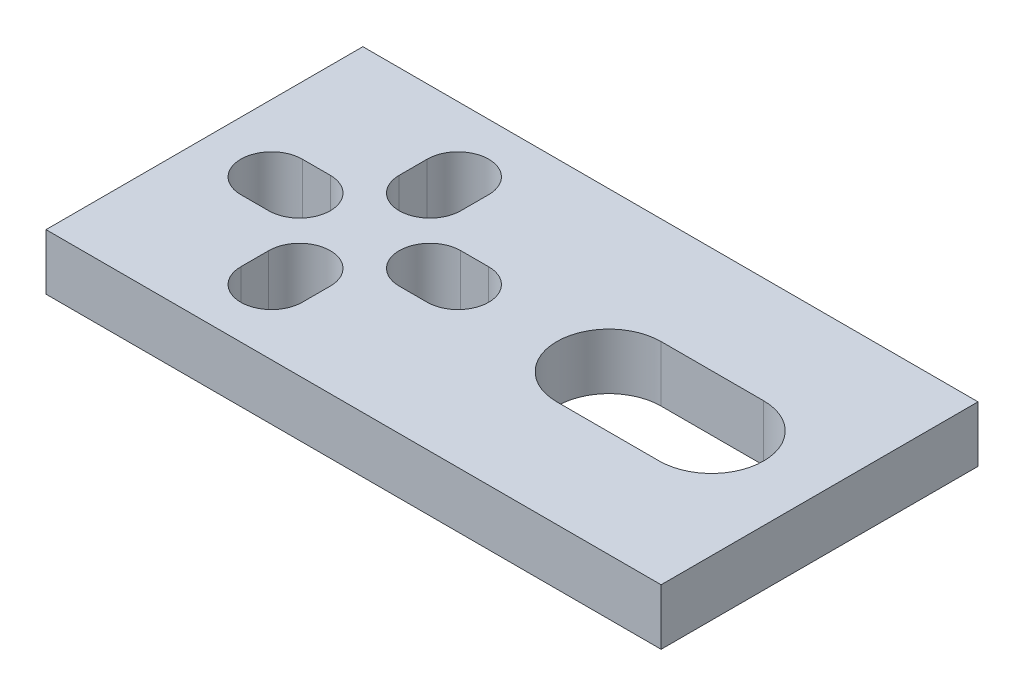
ISO-10303-21;
HEADER;
FILE_DESCRIPTION(('STEP AP214'),'2;1');
FILE_NAME('part.step','',(''),(''),'','','');
FILE_SCHEMA(('AUTOMOTIVE_DESIGN { 1 0 10303 214 1 1 1 1 }'));
ENDSEC;
DATA;
#1=APPLICATION_CONTEXT('core data for automotive mechanical design processes');
#2=APPLICATION_PROTOCOL_DEFINITION('international standard','automotive_design',2000,#1);
#3=PRODUCT_CONTEXT('',#1,'mechanical');
#4=PRODUCT('Part','Part','',(#3));
#5=PRODUCT_RELATED_PRODUCT_CATEGORY('part','',(#4));
#6=PRODUCT_DEFINITION_FORMATION('','',#4);
#7=PRODUCT_DEFINITION_CONTEXT('part definition',#1,'design');
#8=PRODUCT_DEFINITION('design','',#6,#7);
#9=PRODUCT_DEFINITION_SHAPE('','',#8);
#10=(LENGTH_UNIT() NAMED_UNIT(*) SI_UNIT(.MILLI.,.METRE.));
#11=(NAMED_UNIT(*) PLANE_ANGLE_UNIT() SI_UNIT($,.RADIAN.));
#12=(NAMED_UNIT(*) SI_UNIT($,.STERADIAN.) SOLID_ANGLE_UNIT());
#13=UNCERTAINTY_MEASURE_WITH_UNIT(LENGTH_MEASURE(1.E-05),#10,'distance_accuracy_value','');
#14=(GEOMETRIC_REPRESENTATION_CONTEXT(3) GLOBAL_UNCERTAINTY_ASSIGNED_CONTEXT((#13)) GLOBAL_UNIT_ASSIGNED_CONTEXT((#10,
#11,#12)) REPRESENTATION_CONTEXT('',''));
#15=CARTESIAN_POINT('',(0.,0.,0.));
#16=DIRECTION('',(0.,0.,1.));
#17=DIRECTION('',(1.,0.,0.));
#18=AXIS2_PLACEMENT_3D('',#15,#16,#17);
#19=CARTESIAN_POINT('',(0.,3.,0.));
#20=DIRECTION('',(1.,0.,0.));
#21=DIRECTION('',(0.,0.,-1.));
#22=AXIS2_PLACEMENT_3D('',#19,#20,#21);
#23=PLANE('',#22);
#24=DIRECTION('',(0.,0.,1.));
#25=VECTOR('',#24,1.);
#26=CARTESIAN_POINT('',(0.,0.,0.));
#27=LINE('',#26,#25);
#28=CARTESIAN_POINT('',(0.,0.,-17.));
#29=VERTEX_POINT('',#28);
#30=CARTESIAN_POINT('',(0.,0.,0.));
#31=VERTEX_POINT('',#30);
#32=EDGE_CURVE('E352',#29,#31,#27,.T.);
#33=ORIENTED_EDGE('',*,*,#32,.T.);
#34=DIRECTION('',(0.,-1.,0.));
#35=VECTOR('',#34,1.);
#36=CARTESIAN_POINT('',(0.,3.,0.));
#37=LINE('',#36,#35);
#38=CARTESIAN_POINT('',(0.,3.,0.));
#39=VERTEX_POINT('',#38);
#40=EDGE_CURVE('E11',#39,#31,#37,.T.);
#41=ORIENTED_EDGE('',*,*,#40,.F.);
#42=DIRECTION('',(0.,0.,1.));
#43=VECTOR('',#42,1.);
#44=CARTESIAN_POINT('',(0.,3.,0.));
#45=LINE('',#44,#43);
#46=CARTESIAN_POINT('',(0.,3.,-17.));
#47=VERTEX_POINT('',#46);
#48=EDGE_CURVE('E359',#47,#39,#45,.T.);
#49=ORIENTED_EDGE('',*,*,#48,.F.);
#50=DIRECTION('',(0.,-1.,0.));
#51=VECTOR('',#50,1.);
#52=CARTESIAN_POINT('',(0.,3.,-17.));
#53=LINE('',#52,#51);
#54=EDGE_CURVE('E369',#47,#29,#53,.T.);
#55=ORIENTED_EDGE('',*,*,#54,.T.);
#56=EDGE_LOOP('',(#33,#41,#49,#55));
#57=FACE_BOUND('',#56,.T.);
#58=ADVANCED_FACE('F34',(#57),#23,.F.);
#59=CARTESIAN_POINT('',(0.,3.,0.));
#60=DIRECTION('',(0.,0.,-1.));
#61=DIRECTION('',(-1.,0.,0.));
#62=AXIS2_PLACEMENT_3D('',#59,#60,#61);
#63=PLANE('',#62);
#64=DIRECTION('',(1.,0.,0.));
#65=VECTOR('',#64,1.);
#66=CARTESIAN_POINT('',(0.,0.,0.));
#67=LINE('',#66,#65);
#68=CARTESIAN_POINT('',(33.,0.,0.));
#69=VERTEX_POINT('',#68);
#70=EDGE_CURVE('E372',#31,#69,#67,.T.);
#71=ORIENTED_EDGE('',*,*,#70,.T.);
#72=DIRECTION('',(0.,-1.,0.));
#73=VECTOR('',#72,1.);
#74=CARTESIAN_POINT('',(33.,3.,0.));
#75=LINE('',#74,#73);
#76=CARTESIAN_POINT('',(33.,3.,0.));
#77=VERTEX_POINT('',#76);
#78=EDGE_CURVE('E41',#77,#69,#75,.T.);
#79=ORIENTED_EDGE('',*,*,#78,.F.);
#80=DIRECTION('',(1.,0.,0.));
#81=VECTOR('',#80,1.);
#82=CARTESIAN_POINT('',(0.,3.,0.));
#83=LINE('',#82,#81);
#84=EDGE_CURVE('E362',#39,#77,#83,.T.);
#85=ORIENTED_EDGE('',*,*,#84,.F.);
#86=ORIENTED_EDGE('',*,*,#40,.T.);
#87=EDGE_LOOP('',(#71,#79,#85,#86));
#88=FACE_BOUND('',#87,.T.);
#89=ADVANCED_FACE('F401',(#88),#63,.F.);
#90=CARTESIAN_POINT('',(33.,3.,0.));
#91=DIRECTION('',(-1.,0.,0.));
#92=DIRECTION('',(0.,0.,1.));
#93=AXIS2_PLACEMENT_3D('',#90,#91,#92);
#94=PLANE('',#93);
#95=DIRECTION('',(0.,0.,-1.));
#96=VECTOR('',#95,1.);
#97=CARTESIAN_POINT('',(33.,0.,0.));
#98=LINE('',#97,#96);
#99=CARTESIAN_POINT('',(33.,0.,-17.));
#100=VERTEX_POINT('',#99);
#101=EDGE_CURVE('E374',#69,#100,#98,.T.);
#102=ORIENTED_EDGE('',*,*,#101,.T.);
#103=DIRECTION('',(0.,-1.,0.));
#104=VECTOR('',#103,1.);
#105=CARTESIAN_POINT('',(33.,3.,-17.));
#106=LINE('',#105,#104);
#107=CARTESIAN_POINT('',(33.,3.,-17.));
#108=VERTEX_POINT('',#107);
#109=EDGE_CURVE('E379',#108,#100,#106,.T.);
#110=ORIENTED_EDGE('',*,*,#109,.F.);
#111=DIRECTION('',(0.,0.,-1.));
#112=VECTOR('',#111,1.);
#113=CARTESIAN_POINT('',(33.,3.,0.));
#114=LINE('',#113,#112);
#115=EDGE_CURVE('E365',#77,#108,#114,.T.);
#116=ORIENTED_EDGE('',*,*,#115,.F.);
#117=ORIENTED_EDGE('',*,*,#78,.T.);
#118=EDGE_LOOP('',(#102,#110,#116,#117));
#119=FACE_BOUND('',#118,.T.);
#120=ADVANCED_FACE('F386',(#119),#94,.F.);
#121=CARTESIAN_POINT('',(0.,3.,-17.));
#122=DIRECTION('',(0.,0.,1.));
#123=DIRECTION('',(1.,0.,0.));
#124=AXIS2_PLACEMENT_3D('',#121,#122,#123);
#125=PLANE('',#124);
#126=DIRECTION('',(-1.,0.,0.));
#127=VECTOR('',#126,1.);
#128=CARTESIAN_POINT('',(0.,0.,-17.));
#129=LINE('',#128,#127);
#130=EDGE_CURVE('E363',#100,#29,#129,.T.);
#131=ORIENTED_EDGE('',*,*,#130,.T.);
#132=ORIENTED_EDGE('',*,*,#54,.F.);
#133=DIRECTION('',(-1.,0.,0.));
#134=VECTOR('',#133,1.);
#135=CARTESIAN_POINT('',(0.,3.,-17.));
#136=LINE('',#135,#134);
#137=EDGE_CURVE('E367',#108,#47,#136,.T.);
#138=ORIENTED_EDGE('',*,*,#137,.F.);
#139=ORIENTED_EDGE('',*,*,#109,.T.);
#140=EDGE_LOOP('',(#131,#132,#138,#139));
#141=FACE_BOUND('',#140,.T.);
#142=ADVANCED_FACE('F394',(#141),#125,.F.);
#143=CARTESIAN_POINT('',(0.,3.,0.));
#144=DIRECTION('',(0.,-1.,0.));
#145=DIRECTION('',(0.,0.,-1.));
#146=AXIS2_PLACEMENT_3D('',#143,#144,#145);
#147=PLANE('',#146);
#148=DIRECTION('',(0.,0.,1.));
#149=VECTOR('',#148,1.);
#150=CARTESIAN_POINT('',(6.94999999999999,3.,-5.));
#151=LINE('',#150,#149);
#152=CARTESIAN_POINT('',(6.94999999999999,3.,-5.));
#153=VERTEX_POINT('',#152);
#154=CARTESIAN_POINT('',(6.94999999999999,3.,-3.5));
#155=VERTEX_POINT('',#154);
#156=EDGE_CURVE('E221',#153,#155,#151,.T.);
#157=ORIENTED_EDGE('',*,*,#156,.F.);
#158=CARTESIAN_POINT('',(8.6,3.,-5.));
#159=DIRECTION('',(0.,1.,0.));
#160=DIRECTION('',(0.,0.,-1.));
#161=AXIS2_PLACEMENT_3D('',#158,#159,#160);
#162=CIRCLE('',#161,1.65000000000001);
#163=CARTESIAN_POINT('',(10.25,3.,-5.));
#164=VERTEX_POINT('',#163);
#165=EDGE_CURVE('E48',#164,#153,#162,.T.);
#166=ORIENTED_EDGE('',*,*,#165,.F.);
#167=DIRECTION('',(0.,0.,-1.));
#168=VECTOR('',#167,1.);
#169=CARTESIAN_POINT('',(10.25,3.,-5.));
#170=LINE('',#169,#168);
#171=CARTESIAN_POINT('',(10.25,3.,-3.5));
#172=VERTEX_POINT('',#171);
#173=EDGE_CURVE('E212',#172,#164,#170,.T.);
#174=ORIENTED_EDGE('',*,*,#173,.F.);
#175=CARTESIAN_POINT('',(8.6,3.,-3.5));
#176=DIRECTION('',(0.,1.,0.));
#177=DIRECTION('',(0.,0.,-1.));
#178=AXIS2_PLACEMENT_3D('',#175,#176,#177);
#179=CIRCLE('',#178,1.65);
#180=EDGE_CURVE('E215',#155,#172,#179,.T.);
#181=ORIENTED_EDGE('',*,*,#180,.F.);
#182=EDGE_LOOP('',(#157,#166,#174,#181));
#183=FACE_BOUND('',#182,.T.);
#184=DIRECTION('',(-1.,0.,0.));
#185=VECTOR('',#184,1.);
#186=CARTESIAN_POINT('',(13.6,3.,-10.15));
#187=LINE('',#186,#185);
#188=CARTESIAN_POINT('',(13.6,3.,-10.15));
#189=VERTEX_POINT('',#188);
#190=CARTESIAN_POINT('',(12.1,3.,-10.15));
#191=VERTEX_POINT('',#190);
#192=EDGE_CURVE('E246',#189,#191,#187,.T.);
#193=ORIENTED_EDGE('',*,*,#192,.F.);
#194=CARTESIAN_POINT('',(13.6,3.,-8.5));
#195=DIRECTION('',(0.,1.,0.));
#196=DIRECTION('',(0.,0.,-1.));
#197=AXIS2_PLACEMENT_3D('',#194,#195,#196);
#198=CIRCLE('',#197,1.65);
#199=CARTESIAN_POINT('',(13.6,3.,-6.85));
#200=VERTEX_POINT('',#199);
#201=EDGE_CURVE('E227',#200,#189,#198,.T.);
#202=ORIENTED_EDGE('',*,*,#201,.F.);
#203=DIRECTION('',(1.,0.,0.));
#204=VECTOR('',#203,1.);
#205=CARTESIAN_POINT('',(13.6,3.,-6.85));
#206=LINE('',#205,#204);
#207=CARTESIAN_POINT('',(12.1,3.,-6.85));
#208=VERTEX_POINT('',#207);
#209=EDGE_CURVE('E235',#208,#200,#206,.T.);
#210=ORIENTED_EDGE('',*,*,#209,.F.);
#211=CARTESIAN_POINT('',(12.1,3.,-8.5));
#212=DIRECTION('',(0.,1.,0.));
#213=DIRECTION('',(0.,0.,-1.));
#214=AXIS2_PLACEMENT_3D('',#211,#212,#213);
#215=CIRCLE('',#214,1.65);
#216=EDGE_CURVE('E249',#191,#208,#215,.T.);
#217=ORIENTED_EDGE('',*,*,#216,.F.);
#218=EDGE_LOOP('',(#193,#202,#210,#217));
#219=FACE_BOUND('',#218,.T.);
#220=DIRECTION('',(1.,0.,0.));
#221=VECTOR('',#220,1.);
#222=CARTESIAN_POINT('',(3.6,3.,-6.85));
#223=LINE('',#222,#221);
#224=CARTESIAN_POINT('',(3.6,3.,-6.85));
#225=VERTEX_POINT('',#224);
#226=CARTESIAN_POINT('',(5.1,3.,-6.85));
#227=VERTEX_POINT('',#226);
#228=EDGE_CURVE('E278',#225,#227,#223,.T.);
#229=ORIENTED_EDGE('',*,*,#228,.F.);
#230=CARTESIAN_POINT('',(3.6,3.,-8.5));
#231=DIRECTION('',(0.,1.,0.));
#232=DIRECTION('',(0.,0.,1.));
#233=AXIS2_PLACEMENT_3D('',#230,#231,#232);
#234=CIRCLE('',#233,1.65);
#235=CARTESIAN_POINT('',(3.6,3.,-10.15));
#236=VERTEX_POINT('',#235);
#237=EDGE_CURVE('E256',#236,#225,#234,.T.);
#238=ORIENTED_EDGE('',*,*,#237,.F.);
#239=DIRECTION('',(-1.,0.,0.));
#240=VECTOR('',#239,1.);
#241=CARTESIAN_POINT('',(3.6,3.,-10.15));
#242=LINE('',#241,#240);
#243=CARTESIAN_POINT('',(5.1,3.,-10.15));
#244=VERTEX_POINT('',#243);
#245=EDGE_CURVE('E267',#244,#236,#242,.T.);
#246=ORIENTED_EDGE('',*,*,#245,.F.);
#247=CARTESIAN_POINT('',(5.1,3.,-8.5));
#248=DIRECTION('',(0.,1.,0.));
#249=DIRECTION('',(0.,0.,1.));
#250=AXIS2_PLACEMENT_3D('',#247,#248,#249);
#251=CIRCLE('',#250,1.65);
#252=EDGE_CURVE('E281',#227,#244,#251,.T.);
#253=ORIENTED_EDGE('',*,*,#252,.F.);
#254=EDGE_LOOP('',(#229,#238,#246,#253));
#255=FACE_BOUND('',#254,.T.);
#256=DIRECTION('',(0.,0.,-1.));
#257=VECTOR('',#256,1.);
#258=CARTESIAN_POINT('',(10.25,3.,-12.));
#259=LINE('',#258,#257);
#260=CARTESIAN_POINT('',(10.25,3.,-12.));
#261=VERTEX_POINT('',#260);
#262=CARTESIAN_POINT('',(10.25,3.,-13.5));
#263=VERTEX_POINT('',#262);
#264=EDGE_CURVE('E310',#261,#263,#259,.T.);
#265=ORIENTED_EDGE('',*,*,#264,.F.);
#266=CARTESIAN_POINT('',(8.6,3.,-12.));
#267=DIRECTION('',(0.,1.,0.));
#268=DIRECTION('',(0.,0.,1.));
#269=AXIS2_PLACEMENT_3D('',#266,#267,#268);
#270=CIRCLE('',#269,1.65000000000001);
#271=CARTESIAN_POINT('',(6.94999999999999,3.,-12.));
#272=VERTEX_POINT('',#271);
#273=EDGE_CURVE('E288',#272,#261,#270,.T.);
#274=ORIENTED_EDGE('',*,*,#273,.F.);
#275=DIRECTION('',(0.,0.,1.));
#276=VECTOR('',#275,1.);
#277=CARTESIAN_POINT('',(6.94999999999999,3.,-12.));
#278=LINE('',#277,#276);
#279=CARTESIAN_POINT('',(6.94999999999999,3.,-13.5));
#280=VERTEX_POINT('',#279);
#281=EDGE_CURVE('E299',#280,#272,#278,.T.);
#282=ORIENTED_EDGE('',*,*,#281,.F.);
#283=CARTESIAN_POINT('',(8.6,3.,-13.5));
#284=DIRECTION('',(0.,1.,0.));
#285=DIRECTION('',(0.,0.,1.));
#286=AXIS2_PLACEMENT_3D('',#283,#284,#285);
#287=CIRCLE('',#286,1.65);
#288=EDGE_CURVE('E313',#263,#280,#287,.T.);
#289=ORIENTED_EDGE('',*,*,#288,.F.);
#290=EDGE_LOOP('',(#265,#274,#282,#289));
#291=FACE_BOUND('',#290,.T.);
#292=DIRECTION('',(1.,0.,0.));
#293=VECTOR('',#292,1.);
#294=CARTESIAN_POINT('',(21.7,3.,-5.7));
#295=LINE('',#294,#293);
#296=CARTESIAN_POINT('',(21.7,3.,-5.7));
#297=VERTEX_POINT('',#296);
#298=CARTESIAN_POINT('',(27.2,3.,-5.7));
#299=VERTEX_POINT('',#298);
#300=EDGE_CURVE('E342',#297,#299,#295,.T.);
#301=ORIENTED_EDGE('',*,*,#300,.F.);
#302=CARTESIAN_POINT('',(21.7,3.,-8.5));
#303=DIRECTION('',(0.,1.,0.));
#304=DIRECTION('',(0.,0.,1.));
#305=AXIS2_PLACEMENT_3D('',#302,#303,#304);
#306=CIRCLE('',#305,2.8);
#307=CARTESIAN_POINT('',(21.7,3.,-11.3));
#308=VERTEX_POINT('',#307);
#309=EDGE_CURVE('E320',#308,#297,#306,.T.);
#310=ORIENTED_EDGE('',*,*,#309,.F.);
#311=DIRECTION('',(-1.,0.,0.));
#312=VECTOR('',#311,1.);
#313=CARTESIAN_POINT('',(21.7,3.,-11.3));
#314=LINE('',#313,#312);
#315=CARTESIAN_POINT('',(27.2,3.,-11.3));
#316=VERTEX_POINT('',#315);
#317=EDGE_CURVE('E331',#316,#308,#314,.T.);
#318=ORIENTED_EDGE('',*,*,#317,.F.);
#319=CARTESIAN_POINT('',(27.2,3.,-8.5));
#320=DIRECTION('',(0.,1.,0.));
#321=DIRECTION('',(0.,0.,1.));
#322=AXIS2_PLACEMENT_3D('',#319,#320,#321);
#323=CIRCLE('',#322,2.8);
#324=EDGE_CURVE('E345',#299,#316,#323,.T.);
#325=ORIENTED_EDGE('',*,*,#324,.F.);
#326=EDGE_LOOP('',(#301,#310,#318,#325));
#327=FACE_BOUND('',#326,.T.);
#328=ORIENTED_EDGE('',*,*,#48,.T.);
#329=ORIENTED_EDGE('',*,*,#84,.T.);
#330=ORIENTED_EDGE('',*,*,#115,.T.);
#331=ORIENTED_EDGE('',*,*,#137,.T.);
#332=EDGE_LOOP('',(#328,#329,#330,#331));
#333=FACE_BOUND('',#332,.T.);
#334=ADVANCED_FACE('F400',(#183,#219,#255,#291,#327,#333),#147,.F.);
#335=CARTESIAN_POINT('',(0.,0.,0.));
#336=DIRECTION('',(0.,-1.,0.));
#337=DIRECTION('',(0.,0.,-1.));
#338=AXIS2_PLACEMENT_3D('',#335,#336,#337);
#339=PLANE('',#338);
#340=CARTESIAN_POINT('',(8.6,0.,-5.));
#341=DIRECTION('',(0.,1.,0.));
#342=DIRECTION('',(0.,0.,-1.));
#343=AXIS2_PLACEMENT_3D('',#340,#341,#342);
#344=CIRCLE('',#343,1.65000000000001);
#345=CARTESIAN_POINT('',(10.25,0.,-5.));
#346=VERTEX_POINT('',#345);
#347=CARTESIAN_POINT('',(6.94999999999999,0.,-5.));
#348=VERTEX_POINT('',#347);
#349=EDGE_CURVE('E196',#346,#348,#344,.T.);
#350=ORIENTED_EDGE('',*,*,#349,.T.);
#351=DIRECTION('',(0.,0.,1.));
#352=VECTOR('',#351,1.);
#353=CARTESIAN_POINT('',(6.94999999999999,0.,-5.));
#354=LINE('',#353,#352);
#355=CARTESIAN_POINT('',(6.94999999999999,0.,-3.5));
#356=VERTEX_POINT('',#355);
#357=EDGE_CURVE('E205',#348,#356,#354,.T.);
#358=ORIENTED_EDGE('',*,*,#357,.T.);
#359=CARTESIAN_POINT('',(8.6,0.,-3.5));
#360=DIRECTION('',(0.,1.,0.));
#361=DIRECTION('',(0.,0.,-1.));
#362=AXIS2_PLACEMENT_3D('',#359,#360,#361);
#363=CIRCLE('',#362,1.65);
#364=CARTESIAN_POINT('',(10.25,0.,-3.5));
#365=VERTEX_POINT('',#364);
#366=EDGE_CURVE('E56',#356,#365,#363,.T.);
#367=ORIENTED_EDGE('',*,*,#366,.T.);
#368=DIRECTION('',(0.,0.,-1.));
#369=VECTOR('',#368,1.);
#370=CARTESIAN_POINT('',(10.25,0.,-5.));
#371=LINE('',#370,#369);
#372=EDGE_CURVE('E202',#365,#346,#371,.T.);
#373=ORIENTED_EDGE('',*,*,#372,.T.);
#374=EDGE_LOOP('',(#350,#358,#367,#373));
#375=FACE_BOUND('',#374,.T.);
#376=CARTESIAN_POINT('',(13.6,0.,-8.5));
#377=DIRECTION('',(0.,1.,0.));
#378=DIRECTION('',(0.,0.,-1.));
#379=AXIS2_PLACEMENT_3D('',#376,#377,#378);
#380=CIRCLE('',#379,1.65);
#381=CARTESIAN_POINT('',(13.6,0.,-6.85));
#382=VERTEX_POINT('',#381);
#383=CARTESIAN_POINT('',(13.6,0.,-10.15));
#384=VERTEX_POINT('',#383);
#385=EDGE_CURVE('E231',#382,#384,#380,.T.);
#386=ORIENTED_EDGE('',*,*,#385,.T.);
#387=DIRECTION('',(-1.,0.,0.));
#388=VECTOR('',#387,1.);
#389=CARTESIAN_POINT('',(13.6,0.,-10.15));
#390=LINE('',#389,#388);
#391=CARTESIAN_POINT('',(12.1,0.,-10.15));
#392=VERTEX_POINT('',#391);
#393=EDGE_CURVE('E234',#384,#392,#390,.T.);
#394=ORIENTED_EDGE('',*,*,#393,.T.);
#395=CARTESIAN_POINT('',(12.1,0.,-8.5));
#396=DIRECTION('',(0.,1.,0.));
#397=DIRECTION('',(0.,0.,-1.));
#398=AXIS2_PLACEMENT_3D('',#395,#396,#397);
#399=CIRCLE('',#398,1.65);
#400=CARTESIAN_POINT('',(12.1,0.,-6.85));
#401=VERTEX_POINT('',#400);
#402=EDGE_CURVE('E238',#392,#401,#399,.T.);
#403=ORIENTED_EDGE('',*,*,#402,.T.);
#404=DIRECTION('',(1.,0.,0.));
#405=VECTOR('',#404,1.);
#406=CARTESIAN_POINT('',(13.6,0.,-6.85));
#407=LINE('',#406,#405);
#408=EDGE_CURVE('E241',#401,#382,#407,.T.);
#409=ORIENTED_EDGE('',*,*,#408,.T.);
#410=EDGE_LOOP('',(#386,#394,#403,#409));
#411=FACE_BOUND('',#410,.T.);
#412=CARTESIAN_POINT('',(3.6,0.,-8.5));
#413=DIRECTION('',(0.,1.,0.));
#414=DIRECTION('',(0.,0.,1.));
#415=AXIS2_PLACEMENT_3D('',#412,#413,#414);
#416=CIRCLE('',#415,1.65);
#417=CARTESIAN_POINT('',(3.6,0.,-10.15));
#418=VERTEX_POINT('',#417);
#419=CARTESIAN_POINT('',(3.6,0.,-6.85));
#420=VERTEX_POINT('',#419);
#421=EDGE_CURVE('E263',#418,#420,#416,.T.);
#422=ORIENTED_EDGE('',*,*,#421,.T.);
#423=DIRECTION('',(1.,0.,0.));
#424=VECTOR('',#423,1.);
#425=CARTESIAN_POINT('',(3.6,0.,-6.85));
#426=LINE('',#425,#424);
#427=CARTESIAN_POINT('',(5.1,0.,-6.85));
#428=VERTEX_POINT('',#427);
#429=EDGE_CURVE('E266',#420,#428,#426,.T.);
#430=ORIENTED_EDGE('',*,*,#429,.T.);
#431=CARTESIAN_POINT('',(5.1,0.,-8.5));
#432=DIRECTION('',(0.,1.,0.));
#433=DIRECTION('',(0.,0.,1.));
#434=AXIS2_PLACEMENT_3D('',#431,#432,#433);
#435=CIRCLE('',#434,1.65);
#436=CARTESIAN_POINT('',(5.1,0.,-10.15));
#437=VERTEX_POINT('',#436);
#438=EDGE_CURVE('E270',#428,#437,#435,.T.);
#439=ORIENTED_EDGE('',*,*,#438,.T.);
#440=DIRECTION('',(-1.,0.,0.));
#441=VECTOR('',#440,1.);
#442=CARTESIAN_POINT('',(3.6,0.,-10.15));
#443=LINE('',#442,#441);
#444=EDGE_CURVE('E273',#437,#418,#443,.T.);
#445=ORIENTED_EDGE('',*,*,#444,.T.);
#446=EDGE_LOOP('',(#422,#430,#439,#445));
#447=FACE_BOUND('',#446,.T.);
#448=CARTESIAN_POINT('',(8.6,0.,-12.));
#449=DIRECTION('',(0.,1.,0.));
#450=DIRECTION('',(0.,0.,1.));
#451=AXIS2_PLACEMENT_3D('',#448,#449,#450);
#452=CIRCLE('',#451,1.65000000000001);
#453=CARTESIAN_POINT('',(6.94999999999999,0.,-12.));
#454=VERTEX_POINT('',#453);
#455=CARTESIAN_POINT('',(10.25,0.,-12.));
#456=VERTEX_POINT('',#455);
#457=EDGE_CURVE('E295',#454,#456,#452,.T.);
#458=ORIENTED_EDGE('',*,*,#457,.T.);
#459=DIRECTION('',(0.,0.,-1.));
#460=VECTOR('',#459,1.);
#461=CARTESIAN_POINT('',(10.25,0.,-12.));
#462=LINE('',#461,#460);
#463=CARTESIAN_POINT('',(10.25,0.,-13.5));
#464=VERTEX_POINT('',#463);
#465=EDGE_CURVE('E298',#456,#464,#462,.T.);
#466=ORIENTED_EDGE('',*,*,#465,.T.);
#467=CARTESIAN_POINT('',(8.6,0.,-13.5));
#468=DIRECTION('',(0.,1.,0.));
#469=DIRECTION('',(0.,0.,1.));
#470=AXIS2_PLACEMENT_3D('',#467,#468,#469);
#471=CIRCLE('',#470,1.65);
#472=CARTESIAN_POINT('',(6.94999999999999,0.,-13.5));
#473=VERTEX_POINT('',#472);
#474=EDGE_CURVE('E302',#464,#473,#471,.T.);
#475=ORIENTED_EDGE('',*,*,#474,.T.);
#476=DIRECTION('',(0.,0.,1.));
#477=VECTOR('',#476,1.);
#478=CARTESIAN_POINT('',(6.94999999999999,0.,-12.));
#479=LINE('',#478,#477);
#480=EDGE_CURVE('E305',#473,#454,#479,.T.);
#481=ORIENTED_EDGE('',*,*,#480,.T.);
#482=EDGE_LOOP('',(#458,#466,#475,#481));
#483=FACE_BOUND('',#482,.T.);
#484=CARTESIAN_POINT('',(21.7,0.,-8.5));
#485=DIRECTION('',(0.,1.,0.));
#486=DIRECTION('',(0.,0.,1.));
#487=AXIS2_PLACEMENT_3D('',#484,#485,#486);
#488=CIRCLE('',#487,2.8);
#489=CARTESIAN_POINT('',(21.7,0.,-11.3));
#490=VERTEX_POINT('',#489);
#491=CARTESIAN_POINT('',(21.7,0.,-5.7));
#492=VERTEX_POINT('',#491);
#493=EDGE_CURVE('E327',#490,#492,#488,.T.);
#494=ORIENTED_EDGE('',*,*,#493,.T.);
#495=DIRECTION('',(1.,0.,0.));
#496=VECTOR('',#495,1.);
#497=CARTESIAN_POINT('',(21.7,0.,-5.7));
#498=LINE('',#497,#496);
#499=CARTESIAN_POINT('',(27.2,0.,-5.7));
#500=VERTEX_POINT('',#499);
#501=EDGE_CURVE('E330',#492,#500,#498,.T.);
#502=ORIENTED_EDGE('',*,*,#501,.T.);
#503=CARTESIAN_POINT('',(27.2,0.,-8.5));
#504=DIRECTION('',(0.,1.,0.));
#505=DIRECTION('',(0.,0.,1.));
#506=AXIS2_PLACEMENT_3D('',#503,#504,#505);
#507=CIRCLE('',#506,2.8);
#508=CARTESIAN_POINT('',(27.2,0.,-11.3));
#509=VERTEX_POINT('',#508);
#510=EDGE_CURVE('E334',#500,#509,#507,.T.);
#511=ORIENTED_EDGE('',*,*,#510,.T.);
#512=DIRECTION('',(-1.,0.,0.));
#513=VECTOR('',#512,1.);
#514=CARTESIAN_POINT('',(21.7,0.,-11.3));
#515=LINE('',#514,#513);
#516=EDGE_CURVE('E337',#509,#490,#515,.T.);
#517=ORIENTED_EDGE('',*,*,#516,.T.);
#518=EDGE_LOOP('',(#494,#502,#511,#517));
#519=FACE_BOUND('',#518,.T.);
#520=ORIENTED_EDGE('',*,*,#32,.F.);
#521=ORIENTED_EDGE('',*,*,#130,.F.);
#522=ORIENTED_EDGE('',*,*,#101,.F.);
#523=ORIENTED_EDGE('',*,*,#70,.F.);
#524=EDGE_LOOP('',(#520,#521,#522,#523));
#525=FACE_BOUND('',#524,.T.);
#526=ADVANCED_FACE('F209',(#375,#411,#447,#483,#519,#525),#339,.T.);
#527=CARTESIAN_POINT('',(21.7,0.,-8.5));
#528=DIRECTION('',(0.,1.,0.));
#529=DIRECTION('',(0.,0.,1.));
#530=AXIS2_PLACEMENT_3D('',#527,#528,#529);
#531=CYLINDRICAL_SURFACE('',#530,2.8);
#532=ORIENTED_EDGE('',*,*,#309,.T.);
#533=DIRECTION('',(0.,1.,0.));
#534=VECTOR('',#533,1.);
#535=CARTESIAN_POINT('',(21.7,0.,-5.7));
#536=LINE('',#535,#534);
#537=EDGE_CURVE('E340',#492,#297,#536,.T.);
#538=ORIENTED_EDGE('',*,*,#537,.F.);
#539=ORIENTED_EDGE('',*,*,#493,.F.);
#540=DIRECTION('',(0.,1.,0.));
#541=VECTOR('',#540,1.);
#542=CARTESIAN_POINT('',(21.7,0.,-11.3));
#543=LINE('',#542,#541);
#544=EDGE_CURVE('E350',#490,#308,#543,.T.);
#545=ORIENTED_EDGE('',*,*,#544,.T.);
#546=EDGE_LOOP('',(#532,#538,#539,#545));
#547=FACE_BOUND('',#546,.T.);
#548=ADVANCED_FACE('F413',(#547),#531,.F.);
#549=CARTESIAN_POINT('',(21.7,0.,-11.3));
#550=DIRECTION('',(0.,0.,-1.));
#551=DIRECTION('',(-1.,0.,0.));
#552=AXIS2_PLACEMENT_3D('',#549,#550,#551);
#553=PLANE('',#552);
#554=ORIENTED_EDGE('',*,*,#317,.T.);
#555=ORIENTED_EDGE('',*,*,#544,.F.);
#556=ORIENTED_EDGE('',*,*,#516,.F.);
#557=DIRECTION('',(0.,1.,0.));
#558=VECTOR('',#557,1.);
#559=CARTESIAN_POINT('',(27.2,0.,-11.3));
#560=LINE('',#559,#558);
#561=EDGE_CURVE('E353',#509,#316,#560,.T.);
#562=ORIENTED_EDGE('',*,*,#561,.T.);
#563=EDGE_LOOP('',(#554,#555,#556,#562));
#564=FACE_BOUND('',#563,.T.);
#565=ADVANCED_FACE('F419',(#564),#553,.F.);
#566=CARTESIAN_POINT('',(27.2,0.,-8.5));
#567=DIRECTION('',(0.,1.,0.));
#568=DIRECTION('',(0.,0.,1.));
#569=AXIS2_PLACEMENT_3D('',#566,#567,#568);
#570=CYLINDRICAL_SURFACE('',#569,2.8);
#571=ORIENTED_EDGE('',*,*,#324,.T.);
#572=ORIENTED_EDGE('',*,*,#561,.F.);
#573=ORIENTED_EDGE('',*,*,#510,.F.);
#574=DIRECTION('',(0.,1.,0.));
#575=VECTOR('',#574,1.);
#576=CARTESIAN_POINT('',(27.2,0.,-5.7));
#577=LINE('',#576,#575);
#578=EDGE_CURVE('E355',#500,#299,#577,.T.);
#579=ORIENTED_EDGE('',*,*,#578,.T.);
#580=EDGE_LOOP('',(#571,#572,#573,#579));
#581=FACE_BOUND('',#580,.T.);
#582=ADVANCED_FACE('F425',(#581),#570,.F.);
#583=CARTESIAN_POINT('',(21.7,0.,-5.7));
#584=DIRECTION('',(0.,0.,1.));
#585=DIRECTION('',(1.,0.,0.));
#586=AXIS2_PLACEMENT_3D('',#583,#584,#585);
#587=PLANE('',#586);
#588=ORIENTED_EDGE('',*,*,#300,.T.);
#589=ORIENTED_EDGE('',*,*,#578,.F.);
#590=ORIENTED_EDGE('',*,*,#501,.F.);
#591=ORIENTED_EDGE('',*,*,#537,.T.);
#592=EDGE_LOOP('',(#588,#589,#590,#591));
#593=FACE_BOUND('',#592,.T.);
#594=ADVANCED_FACE('F421',(#593),#587,.F.);
#595=CARTESIAN_POINT('',(8.6,0.,-12.));
#596=DIRECTION('',(0.,1.,0.));
#597=DIRECTION('',(0.,0.,1.));
#598=AXIS2_PLACEMENT_3D('',#595,#596,#597);
#599=CYLINDRICAL_SURFACE('',#598,1.65000000000001);
#600=ORIENTED_EDGE('',*,*,#273,.T.);
#601=DIRECTION('',(0.,1.,0.));
#602=VECTOR('',#601,1.);
#603=CARTESIAN_POINT('',(10.25,0.,-12.));
#604=LINE('',#603,#602);
#605=EDGE_CURVE('E308',#456,#261,#604,.T.);
#606=ORIENTED_EDGE('',*,*,#605,.F.);
#607=ORIENTED_EDGE('',*,*,#457,.F.);
#608=DIRECTION('',(0.,1.,0.));
#609=VECTOR('',#608,1.);
#610=CARTESIAN_POINT('',(6.94999999999999,0.,-12.));
#611=LINE('',#610,#609);
#612=EDGE_CURVE('E318',#454,#272,#611,.T.);
#613=ORIENTED_EDGE('',*,*,#612,.T.);
#614=EDGE_LOOP('',(#600,#606,#607,#613));
#615=FACE_BOUND('',#614,.T.);
#616=ADVANCED_FACE('F424',(#615),#599,.F.);
#617=CARTESIAN_POINT('',(6.94999999999999,0.,-12.));
#618=DIRECTION('',(-1.,0.,0.));
#619=DIRECTION('',(0.,0.,1.));
#620=AXIS2_PLACEMENT_3D('',#617,#618,#619);
#621=PLANE('',#620);
#622=ORIENTED_EDGE('',*,*,#281,.T.);
#623=ORIENTED_EDGE('',*,*,#612,.F.);
#624=ORIENTED_EDGE('',*,*,#480,.F.);
#625=DIRECTION('',(0.,1.,0.));
#626=VECTOR('',#625,1.);
#627=CARTESIAN_POINT('',(6.94999999999999,0.,-13.5));
#628=LINE('',#627,#626);
#629=EDGE_CURVE('E321',#473,#280,#628,.T.);
#630=ORIENTED_EDGE('',*,*,#629,.T.);
#631=EDGE_LOOP('',(#622,#623,#624,#630));
#632=FACE_BOUND('',#631,.T.);
#633=ADVANCED_FACE('F435',(#632),#621,.F.);
#634=CARTESIAN_POINT('',(8.6,0.,-13.5));
#635=DIRECTION('',(0.,1.,0.));
#636=DIRECTION('',(0.,0.,1.));
#637=AXIS2_PLACEMENT_3D('',#634,#635,#636);
#638=CYLINDRICAL_SURFACE('',#637,1.65);
#639=ORIENTED_EDGE('',*,*,#288,.T.);
#640=ORIENTED_EDGE('',*,*,#629,.F.);
#641=ORIENTED_EDGE('',*,*,#474,.F.);
#642=DIRECTION('',(0.,1.,0.));
#643=VECTOR('',#642,1.);
#644=CARTESIAN_POINT('',(10.25,0.,-13.5));
#645=LINE('',#644,#643);
#646=EDGE_CURVE('E323',#464,#263,#645,.T.);
#647=ORIENTED_EDGE('',*,*,#646,.T.);
#648=EDGE_LOOP('',(#639,#640,#641,#647));
#649=FACE_BOUND('',#648,.T.);
#650=ADVANCED_FACE('F441',(#649),#638,.F.);
#651=CARTESIAN_POINT('',(10.25,0.,-12.));
#652=DIRECTION('',(1.,0.,0.));
#653=DIRECTION('',(0.,0.,-1.));
#654=AXIS2_PLACEMENT_3D('',#651,#652,#653);
#655=PLANE('',#654);
#656=ORIENTED_EDGE('',*,*,#264,.T.);
#657=ORIENTED_EDGE('',*,*,#646,.F.);
#658=ORIENTED_EDGE('',*,*,#465,.F.);
#659=ORIENTED_EDGE('',*,*,#605,.T.);
#660=EDGE_LOOP('',(#656,#657,#658,#659));
#661=FACE_BOUND('',#660,.T.);
#662=ADVANCED_FACE('F437',(#661),#655,.F.);
#663=CARTESIAN_POINT('',(3.6,0.,-8.5));
#664=DIRECTION('',(0.,1.,0.));
#665=DIRECTION('',(0.,0.,1.));
#666=AXIS2_PLACEMENT_3D('',#663,#664,#665);
#667=CYLINDRICAL_SURFACE('',#666,1.65);
#668=ORIENTED_EDGE('',*,*,#237,.T.);
#669=DIRECTION('',(0.,1.,0.));
#670=VECTOR('',#669,1.);
#671=CARTESIAN_POINT('',(3.6,0.,-6.85));
#672=LINE('',#671,#670);
#673=EDGE_CURVE('E276',#420,#225,#672,.T.);
#674=ORIENTED_EDGE('',*,*,#673,.F.);
#675=ORIENTED_EDGE('',*,*,#421,.F.);
#676=DIRECTION('',(0.,1.,0.));
#677=VECTOR('',#676,1.);
#678=CARTESIAN_POINT('',(3.6,0.,-10.15));
#679=LINE('',#678,#677);
#680=EDGE_CURVE('E286',#418,#236,#679,.T.);
#681=ORIENTED_EDGE('',*,*,#680,.T.);
#682=EDGE_LOOP('',(#668,#674,#675,#681));
#683=FACE_BOUND('',#682,.T.);
#684=ADVANCED_FACE('F440',(#683),#667,.F.);
#685=CARTESIAN_POINT('',(3.6,0.,-10.15));
#686=DIRECTION('',(0.,0.,-1.));
#687=DIRECTION('',(-1.,0.,0.));
#688=AXIS2_PLACEMENT_3D('',#685,#686,#687);
#689=PLANE('',#688);
#690=ORIENTED_EDGE('',*,*,#245,.T.);
#691=ORIENTED_EDGE('',*,*,#680,.F.);
#692=ORIENTED_EDGE('',*,*,#444,.F.);
#693=DIRECTION('',(0.,1.,0.));
#694=VECTOR('',#693,1.);
#695=CARTESIAN_POINT('',(5.1,0.,-10.15));
#696=LINE('',#695,#694);
#697=EDGE_CURVE('E289',#437,#244,#696,.T.);
#698=ORIENTED_EDGE('',*,*,#697,.T.);
#699=EDGE_LOOP('',(#690,#691,#692,#698));
#700=FACE_BOUND('',#699,.T.);
#701=ADVANCED_FACE('F451',(#700),#689,.F.);
#702=CARTESIAN_POINT('',(5.1,0.,-8.5));
#703=DIRECTION('',(0.,1.,0.));
#704=DIRECTION('',(0.,0.,1.));
#705=AXIS2_PLACEMENT_3D('',#702,#703,#704);
#706=CYLINDRICAL_SURFACE('',#705,1.65);
#707=ORIENTED_EDGE('',*,*,#252,.T.);
#708=ORIENTED_EDGE('',*,*,#697,.F.);
#709=ORIENTED_EDGE('',*,*,#438,.F.);
#710=DIRECTION('',(0.,1.,0.));
#711=VECTOR('',#710,1.);
#712=CARTESIAN_POINT('',(5.1,0.,-6.85));
#713=LINE('',#712,#711);
#714=EDGE_CURVE('E291',#428,#227,#713,.T.);
#715=ORIENTED_EDGE('',*,*,#714,.T.);
#716=EDGE_LOOP('',(#707,#708,#709,#715));
#717=FACE_BOUND('',#716,.T.);
#718=ADVANCED_FACE('F457',(#717),#706,.F.);
#719=CARTESIAN_POINT('',(3.6,0.,-6.85));
#720=DIRECTION('',(0.,0.,1.));
#721=DIRECTION('',(1.,0.,0.));
#722=AXIS2_PLACEMENT_3D('',#719,#720,#721);
#723=PLANE('',#722);
#724=ORIENTED_EDGE('',*,*,#228,.T.);
#725=ORIENTED_EDGE('',*,*,#714,.F.);
#726=ORIENTED_EDGE('',*,*,#429,.F.);
#727=ORIENTED_EDGE('',*,*,#673,.T.);
#728=EDGE_LOOP('',(#724,#725,#726,#727));
#729=FACE_BOUND('',#728,.T.);
#730=ADVANCED_FACE('F453',(#729),#723,.F.);
#731=CARTESIAN_POINT('',(13.6,0.,-8.5));
#732=DIRECTION('',(0.,1.,0.));
#733=DIRECTION('',(0.,0.,1.));
#734=AXIS2_PLACEMENT_3D('',#731,#732,#733);
#735=CYLINDRICAL_SURFACE('',#734,1.65);
#736=ORIENTED_EDGE('',*,*,#201,.T.);
#737=DIRECTION('',(0.,1.,0.));
#738=VECTOR('',#737,1.);
#739=CARTESIAN_POINT('',(13.6,0.,-10.15));
#740=LINE('',#739,#738);
#741=EDGE_CURVE('E244',#384,#189,#740,.T.);
#742=ORIENTED_EDGE('',*,*,#741,.F.);
#743=ORIENTED_EDGE('',*,*,#385,.F.);
#744=DIRECTION('',(0.,1.,0.));
#745=VECTOR('',#744,1.);
#746=CARTESIAN_POINT('',(13.6,0.,-6.85));
#747=LINE('',#746,#745);
#748=EDGE_CURVE('E254',#382,#200,#747,.T.);
#749=ORIENTED_EDGE('',*,*,#748,.T.);
#750=EDGE_LOOP('',(#736,#742,#743,#749));
#751=FACE_BOUND('',#750,.T.);
#752=ADVANCED_FACE('F456',(#751),#735,.F.);
#753=CARTESIAN_POINT('',(13.6,0.,-6.85));
#754=DIRECTION('',(0.,0.,1.));
#755=DIRECTION('',(1.,0.,0.));
#756=AXIS2_PLACEMENT_3D('',#753,#754,#755);
#757=PLANE('',#756);
#758=ORIENTED_EDGE('',*,*,#209,.T.);
#759=ORIENTED_EDGE('',*,*,#748,.F.);
#760=ORIENTED_EDGE('',*,*,#408,.F.);
#761=DIRECTION('',(0.,1.,0.));
#762=VECTOR('',#761,1.);
#763=CARTESIAN_POINT('',(12.1,0.,-6.85));
#764=LINE('',#763,#762);
#765=EDGE_CURVE('E257',#401,#208,#764,.T.);
#766=ORIENTED_EDGE('',*,*,#765,.T.);
#767=EDGE_LOOP('',(#758,#759,#760,#766));
#768=FACE_BOUND('',#767,.T.);
#769=ADVANCED_FACE('F467',(#768),#757,.F.);
#770=CARTESIAN_POINT('',(12.1,0.,-8.5));
#771=DIRECTION('',(0.,1.,0.));
#772=DIRECTION('',(0.,0.,1.));
#773=AXIS2_PLACEMENT_3D('',#770,#771,#772);
#774=CYLINDRICAL_SURFACE('',#773,1.65);
#775=ORIENTED_EDGE('',*,*,#216,.T.);
#776=ORIENTED_EDGE('',*,*,#765,.F.);
#777=ORIENTED_EDGE('',*,*,#402,.F.);
#778=DIRECTION('',(0.,1.,0.));
#779=VECTOR('',#778,1.);
#780=CARTESIAN_POINT('',(12.1,0.,-10.15));
#781=LINE('',#780,#779);
#782=EDGE_CURVE('E259',#392,#191,#781,.T.);
#783=ORIENTED_EDGE('',*,*,#782,.T.);
#784=EDGE_LOOP('',(#775,#776,#777,#783));
#785=FACE_BOUND('',#784,.T.);
#786=ADVANCED_FACE('F472',(#785),#774,.F.);
#787=CARTESIAN_POINT('',(13.6,0.,-10.15));
#788=DIRECTION('',(0.,0.,-1.));
#789=DIRECTION('',(-1.,0.,0.));
#790=AXIS2_PLACEMENT_3D('',#787,#788,#789);
#791=PLANE('',#790);
#792=ORIENTED_EDGE('',*,*,#192,.T.);
#793=ORIENTED_EDGE('',*,*,#782,.F.);
#794=ORIENTED_EDGE('',*,*,#393,.F.);
#795=ORIENTED_EDGE('',*,*,#741,.T.);
#796=EDGE_LOOP('',(#792,#793,#794,#795));
#797=FACE_BOUND('',#796,.T.);
#798=ADVANCED_FACE('F469',(#797),#791,.F.);
#799=CARTESIAN_POINT('',(8.6,0.,-5.));
#800=DIRECTION('',(0.,1.,0.));
#801=DIRECTION('',(0.,0.,1.));
#802=AXIS2_PLACEMENT_3D('',#799,#800,#801);
#803=CYLINDRICAL_SURFACE('',#802,1.65000000000001);
#804=ORIENTED_EDGE('',*,*,#165,.T.);
#805=DIRECTION('',(0.,1.,0.));
#806=VECTOR('',#805,1.);
#807=CARTESIAN_POINT('',(6.94999999999999,0.,-5.));
#808=LINE('',#807,#806);
#809=EDGE_CURVE('E192',#348,#153,#808,.T.);
#810=ORIENTED_EDGE('',*,*,#809,.F.);
#811=ORIENTED_EDGE('',*,*,#349,.F.);
#812=DIRECTION('',(0.,1.,0.));
#813=VECTOR('',#812,1.);
#814=CARTESIAN_POINT('',(10.25,0.,-5.));
#815=LINE('',#814,#813);
#816=EDGE_CURVE('E225',#346,#164,#815,.T.);
#817=ORIENTED_EDGE('',*,*,#816,.T.);
#818=EDGE_LOOP('',(#804,#810,#811,#817));
#819=FACE_BOUND('',#818,.T.);
#820=ADVANCED_FACE('F194',(#819),#803,.F.);
#821=CARTESIAN_POINT('',(10.25,0.,-5.));
#822=DIRECTION('',(1.,0.,0.));
#823=DIRECTION('',(0.,0.,-1.));
#824=AXIS2_PLACEMENT_3D('',#821,#822,#823);
#825=PLANE('',#824);
#826=ORIENTED_EDGE('',*,*,#173,.T.);
#827=ORIENTED_EDGE('',*,*,#816,.F.);
#828=ORIENTED_EDGE('',*,*,#372,.F.);
#829=DIRECTION('',(0.,1.,0.));
#830=VECTOR('',#829,1.);
#831=CARTESIAN_POINT('',(10.25,0.,-3.5));
#832=LINE('',#831,#830);
#833=EDGE_CURVE('E228',#365,#172,#832,.T.);
#834=ORIENTED_EDGE('',*,*,#833,.T.);
#835=EDGE_LOOP('',(#826,#827,#828,#834));
#836=FACE_BOUND('',#835,.T.);
#837=ADVANCED_FACE('F482',(#836),#825,.F.);
#838=CARTESIAN_POINT('',(8.6,0.,-3.5));
#839=DIRECTION('',(0.,1.,0.));
#840=DIRECTION('',(0.,0.,1.));
#841=AXIS2_PLACEMENT_3D('',#838,#839,#840);
#842=CYLINDRICAL_SURFACE('',#841,1.65);
#843=ORIENTED_EDGE('',*,*,#180,.T.);
#844=ORIENTED_EDGE('',*,*,#833,.F.);
#845=ORIENTED_EDGE('',*,*,#366,.F.);
#846=DIRECTION('',(0.,1.,0.));
#847=VECTOR('',#846,1.);
#848=CARTESIAN_POINT('',(6.94999999999999,0.,-3.5));
#849=LINE('',#848,#847);
#850=EDGE_CURVE('E201',#356,#155,#849,.T.);
#851=ORIENTED_EDGE('',*,*,#850,.T.);
#852=EDGE_LOOP('',(#843,#844,#845,#851));
#853=FACE_BOUND('',#852,.T.);
#854=ADVANCED_FACE('F485',(#853),#842,.F.);
#855=CARTESIAN_POINT('',(6.94999999999999,0.,-5.));
#856=DIRECTION('',(-1.,0.,0.));
#857=DIRECTION('',(0.,0.,1.));
#858=AXIS2_PLACEMENT_3D('',#855,#856,#857);
#859=PLANE('',#858);
#860=ORIENTED_EDGE('',*,*,#156,.T.);
#861=ORIENTED_EDGE('',*,*,#850,.F.);
#862=ORIENTED_EDGE('',*,*,#357,.F.);
#863=ORIENTED_EDGE('',*,*,#809,.T.);
#864=EDGE_LOOP('',(#860,#861,#862,#863));
#865=FACE_BOUND('',#864,.T.);
#866=ADVANCED_FACE('F206',(#865),#859,.F.);
#867=CLOSED_SHELL('',(#58,#89,#120,#142,#334,#526,#548,#565,#582,#594,#616,#633,#650,#662,#684,
#701,#718,#730,#752,#769,#786,#798,#820,#837,#854,#866));
#868=MANIFOLD_SOLID_BREP('B2',#867);
#869=ADVANCED_BREP_SHAPE_REPRESENTATION('',(#18,#868),#14);
#870=SHAPE_DEFINITION_REPRESENTATION(#9,#869);
ENDSEC;
END-ISO-10303-21;
